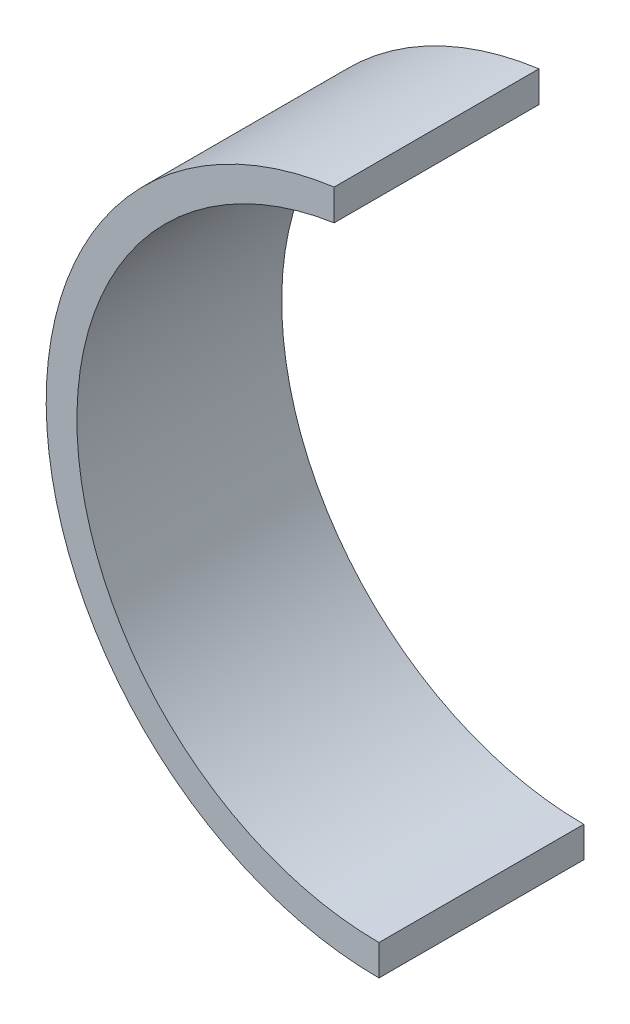
ISO-10303-21;
HEADER;
FILE_DESCRIPTION(('STEP AP214'),'2;1');
FILE_NAME('part.step','',(''),(''),'','','');
FILE_SCHEMA(('AUTOMOTIVE_DESIGN { 1 0 10303 214 1 1 1 1 }'));
ENDSEC;
DATA;
#1=APPLICATION_CONTEXT('core data for automotive mechanical design processes');
#2=APPLICATION_PROTOCOL_DEFINITION('international standard','automotive_design',2000,#1);
#3=PRODUCT_CONTEXT('',#1,'mechanical');
#4=PRODUCT('Part','Part','',(#3));
#5=PRODUCT_RELATED_PRODUCT_CATEGORY('part','',(#4));
#6=PRODUCT_DEFINITION_FORMATION('','',#4);
#7=PRODUCT_DEFINITION_CONTEXT('part definition',#1,'design');
#8=PRODUCT_DEFINITION('design','',#6,#7);
#9=PRODUCT_DEFINITION_SHAPE('','',#8);
#10=(LENGTH_UNIT() NAMED_UNIT(*) SI_UNIT(.MILLI.,.METRE.));
#11=(NAMED_UNIT(*) PLANE_ANGLE_UNIT() SI_UNIT($,.RADIAN.));
#12=(NAMED_UNIT(*) SI_UNIT($,.STERADIAN.) SOLID_ANGLE_UNIT());
#13=UNCERTAINTY_MEASURE_WITH_UNIT(LENGTH_MEASURE(1.E-05),#10,'distance_accuracy_value','');
#14=(GEOMETRIC_REPRESENTATION_CONTEXT(3) GLOBAL_UNCERTAINTY_ASSIGNED_CONTEXT((#13)) GLOBAL_UNIT_ASSIGNED_CONTEXT((#10,
#11,#12)) REPRESENTATION_CONTEXT('',''));
#15=CARTESIAN_POINT('',(0.,0.,0.));
#16=DIRECTION('',(0.,0.,1.));
#17=DIRECTION('',(1.,0.,0.));
#18=AXIS2_PLACEMENT_3D('',#15,#16,#17);
#19=CARTESIAN_POINT('',(0.,0.,20.));
#20=DIRECTION('',(0.,0.,-1.));
#21=DIRECTION('',(-1.,0.,0.));
#22=AXIS2_PLACEMENT_3D('',#19,#20,#21);
#23=CYLINDRICAL_SURFACE('',#22,29.5);
#24=CARTESIAN_POINT('',(0.,0.,0.));
#25=DIRECTION('',(0.,0.,-1.));
#26=DIRECTION('',(1.,0.,0.));
#27=AXIS2_PLACEMENT_3D('',#24,#25,#26);
#28=CIRCLE('',#27,29.5);
#29=CARTESIAN_POINT('',(0.,-29.5,0.));
#30=VERTEX_POINT('',#29);
#31=CARTESIAN_POINT('',(-4.37869131641625,29.1732250934918,0.));
#32=VERTEX_POINT('',#31);
#33=EDGE_CURVE('E95',#30,#32,#28,.T.);
#34=ORIENTED_EDGE('',*,*,#33,.T.);
#35=DIRECTION('',(0.,0.,-1.));
#36=VECTOR('',#35,1.);
#37=CARTESIAN_POINT('',(-4.37869131641625,29.1732250934918,20.));
#38=LINE('',#37,#36);
#39=CARTESIAN_POINT('',(-4.37869131641625,29.1732250934918,20.));
#40=VERTEX_POINT('',#39);
#41=EDGE_CURVE('E11',#40,#32,#38,.T.);
#42=ORIENTED_EDGE('',*,*,#41,.F.);
#43=CARTESIAN_POINT('',(0.,0.,20.));
#44=DIRECTION('',(0.,0.,-1.));
#45=DIRECTION('',(1.,0.,0.));
#46=AXIS2_PLACEMENT_3D('',#43,#44,#45);
#47=CIRCLE('',#46,29.5);
#48=CARTESIAN_POINT('',(0.,-29.5,20.));
#49=VERTEX_POINT('',#48);
#50=EDGE_CURVE('E83',#49,#40,#47,.T.);
#51=ORIENTED_EDGE('',*,*,#50,.F.);
#52=DIRECTION('',(0.,0.,-1.));
#53=VECTOR('',#52,1.);
#54=CARTESIAN_POINT('',(0.,-29.5,20.));
#55=LINE('',#54,#53);
#56=EDGE_CURVE('E91',#49,#30,#55,.T.);
#57=ORIENTED_EDGE('',*,*,#56,.T.);
#58=EDGE_LOOP('',(#34,#42,#51,#57));
#59=FACE_BOUND('',#58,.T.);
#60=ADVANCED_FACE('F32',(#59),#23,.F.);
#61=CARTESIAN_POINT('',(-4.37869131641625,29.1732250934918,20.));
#62=DIRECTION('',(-1.,0.,0.));
#63=DIRECTION('',(0.,0.,1.));
#64=AXIS2_PLACEMENT_3D('',#61,#62,#63);
#65=PLANE('',#64);
#66=DIRECTION('',(0.,1.,0.));
#67=VECTOR('',#66,1.);
#68=CARTESIAN_POINT('',(-4.37869131641625,29.1732250934918,0.));
#69=LINE('',#68,#67);
#70=CARTESIAN_POINT('',(-4.37869131641625,32.2036808820908,0.));
#71=VERTEX_POINT('',#70);
#72=EDGE_CURVE('E87',#32,#71,#69,.T.);
#73=ORIENTED_EDGE('',*,*,#72,.T.);
#74=DIRECTION('',(0.,0.,-1.));
#75=VECTOR('',#74,1.);
#76=CARTESIAN_POINT('',(-4.37869131641625,32.2036808820908,20.));
#77=LINE('',#76,#75);
#78=CARTESIAN_POINT('',(-4.37869131641625,32.2036808820908,20.));
#79=VERTEX_POINT('',#78);
#80=EDGE_CURVE('E40',#79,#71,#77,.T.);
#81=ORIENTED_EDGE('',*,*,#80,.F.);
#82=DIRECTION('',(0.,1.,0.));
#83=VECTOR('',#82,1.);
#84=CARTESIAN_POINT('',(-4.37869131641625,29.1732250934918,20.));
#85=LINE('',#84,#83);
#86=EDGE_CURVE('E78',#40,#79,#85,.T.);
#87=ORIENTED_EDGE('',*,*,#86,.F.);
#88=ORIENTED_EDGE('',*,*,#41,.T.);
#89=EDGE_LOOP('',(#73,#81,#87,#88));
#90=FACE_BOUND('',#89,.T.);
#91=ADVANCED_FACE('F86',(#90),#65,.F.);
#92=CARTESIAN_POINT('',(0.,0.,20.));
#93=DIRECTION('',(0.,0.,-1.));
#94=DIRECTION('',(-1.,0.,0.));
#95=AXIS2_PLACEMENT_3D('',#92,#93,#94);
#96=CYLINDRICAL_SURFACE('',#95,32.5);
#97=CARTESIAN_POINT('',(0.,0.,0.));
#98=DIRECTION('',(0.,0.,1.));
#99=DIRECTION('',(1.,0.,0.));
#100=AXIS2_PLACEMENT_3D('',#97,#98,#99);
#101=CIRCLE('',#100,32.5);
#102=CARTESIAN_POINT('',(0.,-32.5,0.));
#103=VERTEX_POINT('',#102);
#104=EDGE_CURVE('E65',#71,#103,#101,.T.);
#105=ORIENTED_EDGE('',*,*,#104,.T.);
#106=DIRECTION('',(0.,0.,-1.));
#107=VECTOR('',#106,1.);
#108=CARTESIAN_POINT('',(0.,-32.5,20.));
#109=LINE('',#108,#107);
#110=CARTESIAN_POINT('',(0.,-32.5,20.));
#111=VERTEX_POINT('',#110);
#112=EDGE_CURVE('E88',#111,#103,#109,.T.);
#113=ORIENTED_EDGE('',*,*,#112,.F.);
#114=CARTESIAN_POINT('',(0.,0.,20.));
#115=DIRECTION('',(0.,0.,1.));
#116=DIRECTION('',(1.,0.,0.));
#117=AXIS2_PLACEMENT_3D('',#114,#115,#116);
#118=CIRCLE('',#117,32.5);
#119=EDGE_CURVE('E81',#79,#111,#118,.T.);
#120=ORIENTED_EDGE('',*,*,#119,.F.);
#121=ORIENTED_EDGE('',*,*,#80,.T.);
#122=EDGE_LOOP('',(#105,#113,#120,#121));
#123=FACE_BOUND('',#122,.T.);
#124=ADVANCED_FACE('F89',(#123),#96,.T.);
#125=CARTESIAN_POINT('',(0.,-29.5,20.));
#126=DIRECTION('',(-1.,0.,0.));
#127=DIRECTION('',(0.,-1.,0.));
#128=AXIS2_PLACEMENT_3D('',#125,#126,#127);
#129=PLANE('',#128);
#130=DIRECTION('',(0.,1.,0.));
#131=VECTOR('',#130,1.);
#132=CARTESIAN_POINT('',(0.,-29.5,0.));
#133=LINE('',#132,#131);
#134=EDGE_CURVE('E71',#103,#30,#133,.T.);
#135=ORIENTED_EDGE('',*,*,#134,.T.);
#136=ORIENTED_EDGE('',*,*,#56,.F.);
#137=DIRECTION('',(0.,1.,0.));
#138=VECTOR('',#137,1.);
#139=CARTESIAN_POINT('',(0.,-29.5,20.));
#140=LINE('',#139,#138);
#141=EDGE_CURVE('E48',#111,#49,#140,.T.);
#142=ORIENTED_EDGE('',*,*,#141,.F.);
#143=ORIENTED_EDGE('',*,*,#112,.T.);
#144=EDGE_LOOP('',(#135,#136,#142,#143));
#145=FACE_BOUND('',#144,.T.);
#146=ADVANCED_FACE('F102',(#145),#129,.F.);
#147=CARTESIAN_POINT('',(0.,0.,20.));
#148=DIRECTION('',(0.,0.,1.));
#149=DIRECTION('',(1.,0.,0.));
#150=AXIS2_PLACEMENT_3D('',#147,#148,#149);
#151=PLANE('',#150);
#152=ORIENTED_EDGE('',*,*,#50,.T.);
#153=ORIENTED_EDGE('',*,*,#86,.T.);
#154=ORIENTED_EDGE('',*,*,#119,.T.);
#155=ORIENTED_EDGE('',*,*,#141,.T.);
#156=EDGE_LOOP('',(#152,#153,#154,#155));
#157=FACE_BOUND('',#156,.T.);
#158=ADVANCED_FACE('F79',(#157),#151,.T.);
#159=CARTESIAN_POINT('',(0.,0.,0.));
#160=DIRECTION('',(0.,0.,1.));
#161=DIRECTION('',(1.,0.,0.));
#162=AXIS2_PLACEMENT_3D('',#159,#160,#161);
#163=PLANE('',#162);
#164=ORIENTED_EDGE('',*,*,#33,.F.);
#165=ORIENTED_EDGE('',*,*,#134,.F.);
#166=ORIENTED_EDGE('',*,*,#104,.F.);
#167=ORIENTED_EDGE('',*,*,#72,.F.);
#168=EDGE_LOOP('',(#164,#165,#166,#167));
#169=FACE_BOUND('',#168,.T.);
#170=ADVANCED_FACE('F105',(#169),#163,.F.);
#171=CLOSED_SHELL('',(#60,#91,#124,#146,#158,#170));
#172=MANIFOLD_SOLID_BREP('B2',#171);
#173=ADVANCED_BREP_SHAPE_REPRESENTATION('',(#18,#172),#14);
#174=SHAPE_DEFINITION_REPRESENTATION(#9,#173);
ENDSEC;
END-ISO-10303-21;
